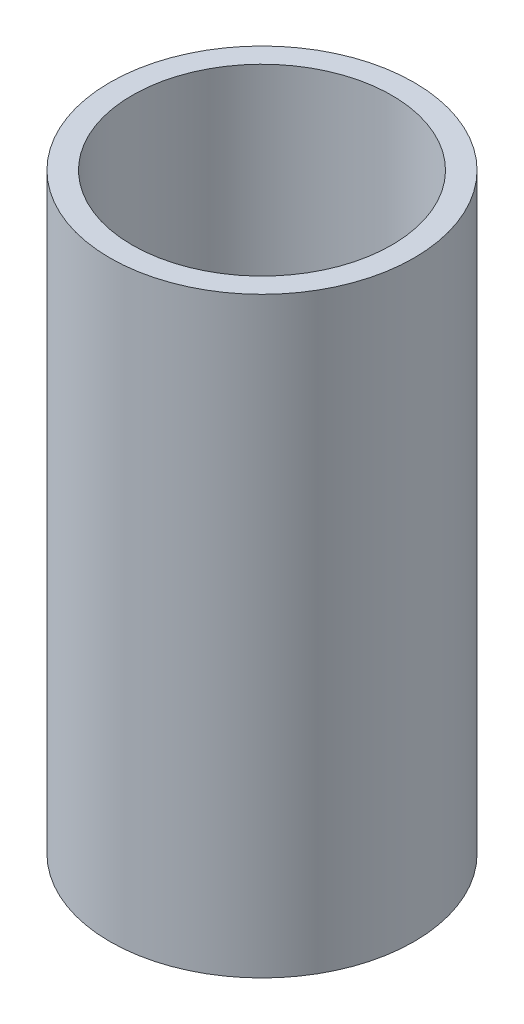
ISO-10303-21;
HEADER;
FILE_DESCRIPTION(('STEP AP214'),'2;1');
FILE_NAME('part.step','',(''),(''),'','','');
FILE_SCHEMA(('AUTOMOTIVE_DESIGN { 1 0 10303 214 1 1 1 1 }'));
ENDSEC;
DATA;
#1=APPLICATION_CONTEXT('core data for automotive mechanical design processes');
#2=APPLICATION_PROTOCOL_DEFINITION('international standard','automotive_design',2000,#1);
#3=PRODUCT_CONTEXT('',#1,'mechanical');
#4=PRODUCT('Part','Part','',(#3));
#5=PRODUCT_RELATED_PRODUCT_CATEGORY('part','',(#4));
#6=PRODUCT_DEFINITION_FORMATION('','',#4);
#7=PRODUCT_DEFINITION_CONTEXT('part definition',#1,'design');
#8=PRODUCT_DEFINITION('design','',#6,#7);
#9=PRODUCT_DEFINITION_SHAPE('','',#8);
#10=(LENGTH_UNIT() NAMED_UNIT(*) SI_UNIT(.MILLI.,.METRE.));
#11=(NAMED_UNIT(*) PLANE_ANGLE_UNIT() SI_UNIT($,.RADIAN.));
#12=(NAMED_UNIT(*) SI_UNIT($,.STERADIAN.) SOLID_ANGLE_UNIT());
#13=UNCERTAINTY_MEASURE_WITH_UNIT(LENGTH_MEASURE(1.E-05),#10,'distance_accuracy_value','');
#14=(GEOMETRIC_REPRESENTATION_CONTEXT(3) GLOBAL_UNCERTAINTY_ASSIGNED_CONTEXT((#13)) GLOBAL_UNIT_ASSIGNED_CONTEXT((#10,
#11,#12)) REPRESENTATION_CONTEXT('',''));
#15=CARTESIAN_POINT('',(0.,0.,0.));
#16=DIRECTION('',(0.,0.,1.));
#17=DIRECTION('',(1.,0.,0.));
#18=AXIS2_PLACEMENT_3D('',#15,#16,#17);
#19=CARTESIAN_POINT('',(0.,36.5,0.));
#20=DIRECTION('',(0.,1.,0.));
#21=DIRECTION('',(0.,0.,1.));
#22=AXIS2_PLACEMENT_3D('',#19,#20,#21);
#23=PLANE('',#22);
#24=CARTESIAN_POINT('',(0.,36.5,0.));
#25=DIRECTION('',(0.,1.,0.));
#26=DIRECTION('',(1.,0.,0.));
#27=AXIS2_PLACEMENT_3D('',#24,#25,#26);
#28=CIRCLE('',#27,9.375);
#29=CARTESIAN_POINT('',(9.375,36.5,0.));
#30=VERTEX_POINT('',#29);
#31=EDGE_CURVE('E11',#30,#30,#28,.T.);
#32=ORIENTED_EDGE('',*,*,#31,.T.);
#33=EDGE_LOOP('',(#32));
#34=FACE_BOUND('',#33,.T.);
#35=CARTESIAN_POINT('',(0.,36.5,0.));
#36=DIRECTION('',(0.,1.,0.));
#37=DIRECTION('',(0.,0.,1.));
#38=AXIS2_PLACEMENT_3D('',#35,#36,#37);
#39=CIRCLE('',#38,8.);
#40=CARTESIAN_POINT('',(0.,36.5,8.));
#41=VERTEX_POINT('',#40);
#42=EDGE_CURVE('E53',#41,#41,#39,.T.);
#43=ORIENTED_EDGE('',*,*,#42,.F.);
#44=EDGE_LOOP('',(#43));
#45=FACE_BOUND('',#44,.T.);
#46=ADVANCED_FACE('F42',(#34,#45),#23,.T.);
#47=CARTESIAN_POINT('',(0.,0.,0.));
#48=DIRECTION('',(0.,1.,0.));
#49=DIRECTION('',(0.,0.,1.));
#50=AXIS2_PLACEMENT_3D('',#47,#48,#49);
#51=PLANE('',#50);
#52=CARTESIAN_POINT('',(0.,0.,0.));
#53=DIRECTION('',(0.,1.,0.));
#54=DIRECTION('',(1.,0.,0.));
#55=AXIS2_PLACEMENT_3D('',#52,#53,#54);
#56=CIRCLE('',#55,9.375);
#57=CARTESIAN_POINT('',(9.375,0.,0.));
#58=VERTEX_POINT('',#57);
#59=EDGE_CURVE('E46',#58,#58,#56,.T.);
#60=ORIENTED_EDGE('',*,*,#59,.F.);
#61=EDGE_LOOP('',(#60));
#62=FACE_BOUND('',#61,.T.);
#63=CARTESIAN_POINT('',(0.,0.,0.));
#64=DIRECTION('',(0.,1.,0.));
#65=DIRECTION('',(0.,0.,1.));
#66=AXIS2_PLACEMENT_3D('',#63,#64,#65);
#67=CIRCLE('',#66,8.);
#68=CARTESIAN_POINT('',(0.,0.,8.));
#69=VERTEX_POINT('',#68);
#70=EDGE_CURVE('E55',#69,#69,#67,.T.);
#71=ORIENTED_EDGE('',*,*,#70,.T.);
#72=EDGE_LOOP('',(#71));
#73=FACE_BOUND('',#72,.T.);
#74=ADVANCED_FACE('F65',(#62,#73),#51,.F.);
#75=CARTESIAN_POINT('',(0.,36.5,0.));
#76=DIRECTION('',(0.,-1.,0.));
#77=DIRECTION('',(0.,0.,-1.));
#78=AXIS2_PLACEMENT_3D('',#75,#76,#77);
#79=CYLINDRICAL_SURFACE('',#78,9.375);
#80=ORIENTED_EDGE('',*,*,#31,.F.);
#81=EDGE_LOOP('',(#80));
#82=FACE_BOUND('',#81,.T.);
#83=ORIENTED_EDGE('',*,*,#59,.T.);
#84=EDGE_LOOP('',(#83));
#85=FACE_BOUND('',#84,.T.);
#86=ADVANCED_FACE('F44',(#82,#85),#79,.T.);
#87=CARTESIAN_POINT('',(0.,36.5,0.));
#88=DIRECTION('',(0.,-1.,0.));
#89=DIRECTION('',(0.,0.,-1.));
#90=AXIS2_PLACEMENT_3D('',#87,#88,#89);
#91=CYLINDRICAL_SURFACE('',#90,8.);
#92=ORIENTED_EDGE('',*,*,#42,.T.);
#93=EDGE_LOOP('',(#92));
#94=FACE_BOUND('',#93,.T.);
#95=ORIENTED_EDGE('',*,*,#70,.F.);
#96=EDGE_LOOP('',(#95));
#97=FACE_BOUND('',#96,.T.);
#98=ADVANCED_FACE('F61',(#94,#97),#91,.F.);
#99=CLOSED_SHELL('',(#46,#74,#86,#98));
#100=MANIFOLD_SOLID_BREP('B2',#99);
#101=ADVANCED_BREP_SHAPE_REPRESENTATION('',(#18,#100),#14);
#102=SHAPE_DEFINITION_REPRESENTATION(#9,#101);
ENDSEC;
END-ISO-10303-21;
